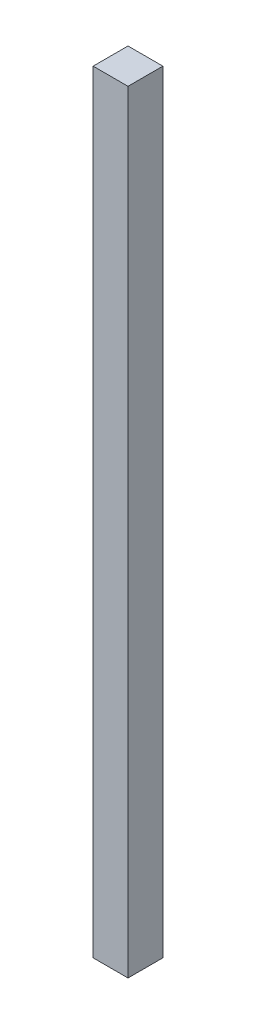
ISO-10303-21;
HEADER;
FILE_DESCRIPTION(('STEP AP214'),'2;1');
FILE_NAME('part.step','',(''),(''),'','','');
FILE_SCHEMA(('AUTOMOTIVE_DESIGN { 1 0 10303 214 1 1 1 1 }'));
ENDSEC;
DATA;
#1=APPLICATION_CONTEXT('core data for automotive mechanical design processes');
#2=APPLICATION_PROTOCOL_DEFINITION('international standard','automotive_design',2000,#1);
#3=PRODUCT_CONTEXT('',#1,'mechanical');
#4=PRODUCT('Part','Part','',(#3));
#5=PRODUCT_RELATED_PRODUCT_CATEGORY('part','',(#4));
#6=PRODUCT_DEFINITION_FORMATION('','',#4);
#7=PRODUCT_DEFINITION_CONTEXT('part definition',#1,'design');
#8=PRODUCT_DEFINITION('design','',#6,#7);
#9=PRODUCT_DEFINITION_SHAPE('','',#8);
#10=(LENGTH_UNIT() NAMED_UNIT(*) SI_UNIT(.MILLI.,.METRE.));
#11=(NAMED_UNIT(*) PLANE_ANGLE_UNIT() SI_UNIT($,.RADIAN.));
#12=(NAMED_UNIT(*) SI_UNIT($,.STERADIAN.) SOLID_ANGLE_UNIT());
#13=UNCERTAINTY_MEASURE_WITH_UNIT(LENGTH_MEASURE(1.E-05),#10,'distance_accuracy_value','');
#14=(GEOMETRIC_REPRESENTATION_CONTEXT(3) GLOBAL_UNCERTAINTY_ASSIGNED_CONTEXT((#13)) GLOBAL_UNIT_ASSIGNED_CONTEXT((#10,
#11,#12)) REPRESENTATION_CONTEXT('',''));
#15=CARTESIAN_POINT('',(0.,0.,0.));
#16=DIRECTION('',(0.,0.,1.));
#17=DIRECTION('',(1.,0.,0.));
#18=AXIS2_PLACEMENT_3D('',#15,#16,#17);
#19=CARTESIAN_POINT('',(7.9056941505,350.,-7.9056941505));
#20=DIRECTION('',(-1.,0.,0.));
#21=DIRECTION('',(0.,0.,1.));
#22=AXIS2_PLACEMENT_3D('',#19,#20,#21);
#23=PLANE('',#22);
#24=DIRECTION('',(0.,0.,-1.));
#25=VECTOR('',#24,1.);
#26=CARTESIAN_POINT('',(7.9056941505,0.,-7.9056941505));
#27=LINE('',#26,#25);
#28=CARTESIAN_POINT('',(7.9056941505,0.,7.9056941505));
#29=VERTEX_POINT('',#28);
#30=CARTESIAN_POINT('',(7.9056941505,0.,-7.9056941505));
#31=VERTEX_POINT('',#30);
#32=EDGE_CURVE('E113',#29,#31,#27,.T.);
#33=ORIENTED_EDGE('',*,*,#32,.T.);
#34=DIRECTION('',(0.,-1.,0.));
#35=VECTOR('',#34,1.);
#36=CARTESIAN_POINT('',(7.9056941505,350.,-7.9056941505));
#37=LINE('',#36,#35);
#38=CARTESIAN_POINT('',(7.9056941505,350.,-7.9056941505));
#39=VERTEX_POINT('',#38);
#40=EDGE_CURVE('E11',#39,#31,#37,.T.);
#41=ORIENTED_EDGE('',*,*,#40,.F.);
#42=DIRECTION('',(0.,0.,-1.));
#43=VECTOR('',#42,1.);
#44=CARTESIAN_POINT('',(7.9056941505,350.,-7.9056941505));
#45=LINE('',#44,#43);
#46=CARTESIAN_POINT('',(7.9056941505,350.,7.9056941505));
#47=VERTEX_POINT('',#46);
#48=EDGE_CURVE('E97',#47,#39,#45,.T.);
#49=ORIENTED_EDGE('',*,*,#48,.F.);
#50=DIRECTION('',(0.,-1.,0.));
#51=VECTOR('',#50,1.);
#52=CARTESIAN_POINT('',(7.9056941505,350.,7.9056941505));
#53=LINE('',#52,#51);
#54=EDGE_CURVE('E109',#47,#29,#53,.T.);
#55=ORIENTED_EDGE('',*,*,#54,.T.);
#56=EDGE_LOOP('',(#33,#41,#49,#55));
#57=FACE_BOUND('',#56,.T.);
#58=ADVANCED_FACE('F45',(#57),#23,.F.);
#59=CARTESIAN_POINT('',(-7.9056941505,350.,-7.9056941505));
#60=DIRECTION('',(0.,0.,1.));
#61=DIRECTION('',(1.,0.,0.));
#62=AXIS2_PLACEMENT_3D('',#59,#60,#61);
#63=PLANE('',#62);
#64=DIRECTION('',(-1.,0.,0.));
#65=VECTOR('',#64,1.);
#66=CARTESIAN_POINT('',(-7.9056941505,0.,-7.9056941505));
#67=LINE('',#66,#65);
#68=CARTESIAN_POINT('',(-7.9056941505,0.,-7.9056941505));
#69=VERTEX_POINT('',#68);
#70=EDGE_CURVE('E102',#31,#69,#67,.T.);
#71=ORIENTED_EDGE('',*,*,#70,.T.);
#72=DIRECTION('',(0.,-1.,0.));
#73=VECTOR('',#72,1.);
#74=CARTESIAN_POINT('',(-7.9056941505,350.,-7.9056941505));
#75=LINE('',#74,#73);
#76=CARTESIAN_POINT('',(-7.9056941505,350.,-7.9056941505));
#77=VERTEX_POINT('',#76);
#78=EDGE_CURVE('E54',#77,#69,#75,.T.);
#79=ORIENTED_EDGE('',*,*,#78,.F.);
#80=DIRECTION('',(-1.,0.,0.));
#81=VECTOR('',#80,1.);
#82=CARTESIAN_POINT('',(-7.9056941505,350.,-7.9056941505));
#83=LINE('',#82,#81);
#84=EDGE_CURVE('E92',#39,#77,#83,.T.);
#85=ORIENTED_EDGE('',*,*,#84,.F.);
#86=ORIENTED_EDGE('',*,*,#40,.T.);
#87=EDGE_LOOP('',(#71,#79,#85,#86));
#88=FACE_BOUND('',#87,.T.);
#89=ADVANCED_FACE('F101',(#88),#63,.F.);
#90=CARTESIAN_POINT('',(-7.9056941505,350.,-7.9056941505));
#91=DIRECTION('',(1.,0.,0.));
#92=DIRECTION('',(0.,0.,-1.));
#93=AXIS2_PLACEMENT_3D('',#90,#91,#92);
#94=PLANE('',#93);
#95=DIRECTION('',(0.,0.,1.));
#96=VECTOR('',#95,1.);
#97=CARTESIAN_POINT('',(-7.9056941505,0.,-7.9056941505));
#98=LINE('',#97,#96);
#99=CARTESIAN_POINT('',(-7.9056941505,0.,7.9056941505));
#100=VERTEX_POINT('',#99);
#101=EDGE_CURVE('E79',#69,#100,#98,.T.);
#102=ORIENTED_EDGE('',*,*,#101,.T.);
#103=DIRECTION('',(0.,-1.,0.));
#104=VECTOR('',#103,1.);
#105=CARTESIAN_POINT('',(-7.9056941505,350.,7.9056941505));
#106=LINE('',#105,#104);
#107=CARTESIAN_POINT('',(-7.9056941505,350.,7.9056941505));
#108=VERTEX_POINT('',#107);
#109=EDGE_CURVE('E104',#108,#100,#106,.T.);
#110=ORIENTED_EDGE('',*,*,#109,.F.);
#111=DIRECTION('',(0.,0.,1.));
#112=VECTOR('',#111,1.);
#113=CARTESIAN_POINT('',(-7.9056941505,350.,-7.9056941505));
#114=LINE('',#113,#112);
#115=EDGE_CURVE('E95',#77,#108,#114,.T.);
#116=ORIENTED_EDGE('',*,*,#115,.F.);
#117=ORIENTED_EDGE('',*,*,#78,.T.);
#118=EDGE_LOOP('',(#102,#110,#116,#117));
#119=FACE_BOUND('',#118,.T.);
#120=ADVANCED_FACE('F105',(#119),#94,.F.);
#121=CARTESIAN_POINT('',(-7.9056941505,350.,7.9056941505));
#122=DIRECTION('',(0.,0.,-1.));
#123=DIRECTION('',(-1.,0.,0.));
#124=AXIS2_PLACEMENT_3D('',#121,#122,#123);
#125=PLANE('',#124);
#126=DIRECTION('',(1.,0.,0.));
#127=VECTOR('',#126,1.);
#128=CARTESIAN_POINT('',(-7.9056941505,0.,7.9056941505));
#129=LINE('',#128,#127);
#130=EDGE_CURVE('E85',#100,#29,#129,.T.);
#131=ORIENTED_EDGE('',*,*,#130,.T.);
#132=ORIENTED_EDGE('',*,*,#54,.F.);
#133=DIRECTION('',(1.,0.,0.));
#134=VECTOR('',#133,1.);
#135=CARTESIAN_POINT('',(-7.9056941505,350.,7.9056941505));
#136=LINE('',#135,#134);
#137=EDGE_CURVE('E62',#108,#47,#136,.T.);
#138=ORIENTED_EDGE('',*,*,#137,.F.);
#139=ORIENTED_EDGE('',*,*,#109,.T.);
#140=EDGE_LOOP('',(#131,#132,#138,#139));
#141=FACE_BOUND('',#140,.T.);
#142=ADVANCED_FACE('F126',(#141),#125,.F.);
#143=CARTESIAN_POINT('',(0.,350.,0.));
#144=DIRECTION('',(0.,1.,0.));
#145=DIRECTION('',(0.,0.,1.));
#146=AXIS2_PLACEMENT_3D('',#143,#144,#145);
#147=PLANE('',#146);
#148=ORIENTED_EDGE('',*,*,#48,.T.);
#149=ORIENTED_EDGE('',*,*,#84,.T.);
#150=ORIENTED_EDGE('',*,*,#115,.T.);
#151=ORIENTED_EDGE('',*,*,#137,.T.);
#152=EDGE_LOOP('',(#148,#149,#150,#151));
#153=FACE_BOUND('',#152,.T.);
#154=ADVANCED_FACE('F93',(#153),#147,.T.);
#155=CARTESIAN_POINT('',(0.,0.,0.));
#156=DIRECTION('',(0.,1.,0.));
#157=DIRECTION('',(0.,0.,1.));
#158=AXIS2_PLACEMENT_3D('',#155,#156,#157);
#159=PLANE('',#158);
#160=ORIENTED_EDGE('',*,*,#32,.F.);
#161=ORIENTED_EDGE('',*,*,#130,.F.);
#162=ORIENTED_EDGE('',*,*,#101,.F.);
#163=ORIENTED_EDGE('',*,*,#70,.F.);
#164=EDGE_LOOP('',(#160,#161,#162,#163));
#165=FACE_BOUND('',#164,.T.);
#166=ADVANCED_FACE('F129',(#165),#159,.F.);
#167=CLOSED_SHELL('',(#58,#89,#120,#142,#154,#166));
#168=MANIFOLD_SOLID_BREP('B2',#167);
#169=ADVANCED_BREP_SHAPE_REPRESENTATION('',(#18,#168),#14);
#170=SHAPE_DEFINITION_REPRESENTATION(#9,#169);
ENDSEC;
END-ISO-10303-21;
